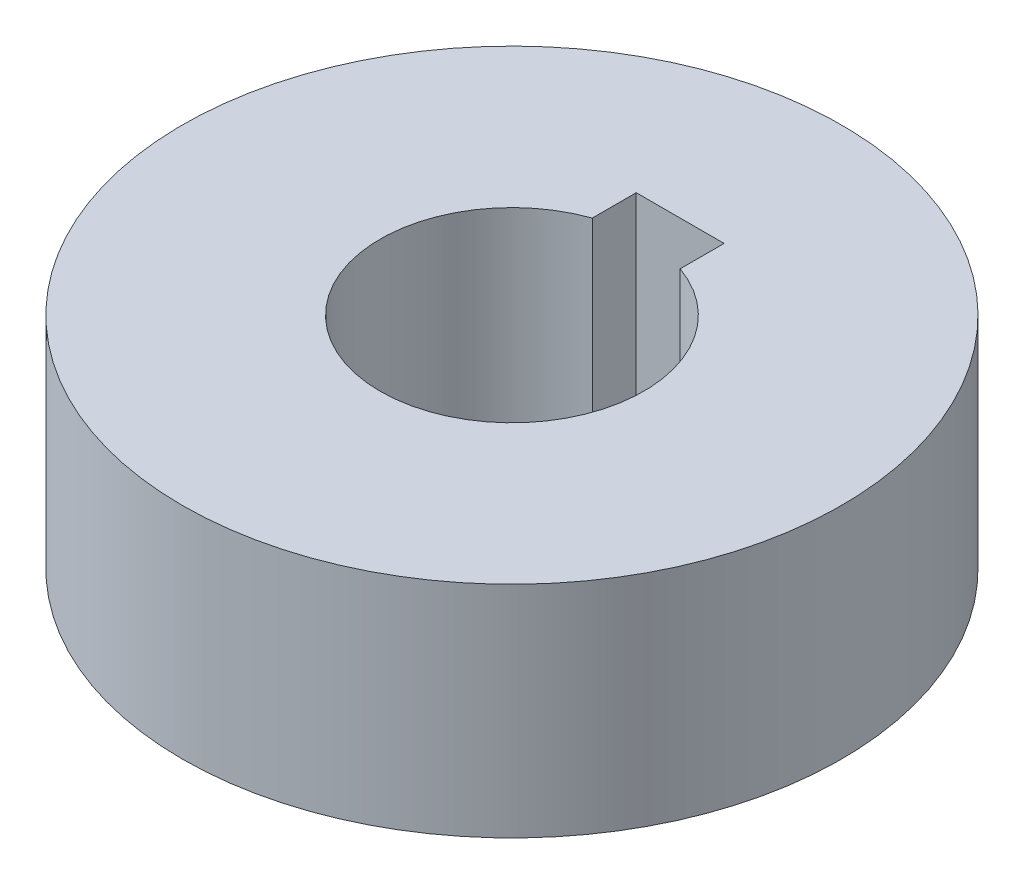
ISO-10303-21;
HEADER;
FILE_DESCRIPTION(('STEP AP214'),'2;1');
FILE_NAME('part.step','',(''),(''),'','','');
FILE_SCHEMA(('AUTOMOTIVE_DESIGN { 1 0 10303 214 1 1 1 1 }'));
ENDSEC;
DATA;
#1=APPLICATION_CONTEXT('core data for automotive mechanical design processes');
#2=APPLICATION_PROTOCOL_DEFINITION('international standard','automotive_design',2000,#1);
#3=PRODUCT_CONTEXT('',#1,'mechanical');
#4=PRODUCT('Part','Part','',(#3));
#5=PRODUCT_RELATED_PRODUCT_CATEGORY('part','',(#4));
#6=PRODUCT_DEFINITION_FORMATION('','',#4);
#7=PRODUCT_DEFINITION_CONTEXT('part definition',#1,'design');
#8=PRODUCT_DEFINITION('design','',#6,#7);
#9=PRODUCT_DEFINITION_SHAPE('','',#8);
#10=(LENGTH_UNIT() NAMED_UNIT(*) SI_UNIT(.MILLI.,.METRE.));
#11=(NAMED_UNIT(*) PLANE_ANGLE_UNIT() SI_UNIT($,.RADIAN.));
#12=(NAMED_UNIT(*) SI_UNIT($,.STERADIAN.) SOLID_ANGLE_UNIT());
#13=UNCERTAINTY_MEASURE_WITH_UNIT(LENGTH_MEASURE(1.E-05),#10,'distance_accuracy_value','');
#14=(GEOMETRIC_REPRESENTATION_CONTEXT(3) GLOBAL_UNCERTAINTY_ASSIGNED_CONTEXT((#13)) GLOBAL_UNIT_ASSIGNED_CONTEXT((#10,
#11,#12)) REPRESENTATION_CONTEXT('',''));
#15=CARTESIAN_POINT('',(0.,0.,0.));
#16=DIRECTION('',(0.,0.,1.));
#17=DIRECTION('',(1.,0.,0.));
#18=AXIS2_PLACEMENT_3D('',#15,#16,#17);
#19=CARTESIAN_POINT('',(0.,10.,0.));
#20=DIRECTION('',(0.,1.,0.));
#21=DIRECTION('',(0.,0.,1.));
#22=AXIS2_PLACEMENT_3D('',#19,#20,#21);
#23=PLANE('',#22);
#24=CARTESIAN_POINT('',(0.,10.,0.));
#25=DIRECTION('',(0.,1.,0.));
#26=DIRECTION('',(0.,0.,1.));
#27=AXIS2_PLACEMENT_3D('',#24,#25,#26);
#28=CIRCLE('',#27,15.);
#29=CARTESIAN_POINT('',(0.,10.,15.));
#30=VERTEX_POINT('',#29);
#31=EDGE_CURVE('E11',#30,#30,#28,.T.);
#32=ORIENTED_EDGE('',*,*,#31,.T.);
#33=EDGE_LOOP('',(#32));
#34=FACE_BOUND('',#33,.T.);
#35=DIRECTION('',(-1.,0.,0.));
#36=VECTOR('',#35,1.);
#37=CARTESIAN_POINT('',(0.,10.,-7.65685424949238));
#38=LINE('',#37,#36);
#39=CARTESIAN_POINT('',(2.,10.,-7.65685424949238));
#40=VERTEX_POINT('',#39);
#41=CARTESIAN_POINT('',(-2.,10.,-7.65685424949238));
#42=VERTEX_POINT('',#41);
#43=EDGE_CURVE('E93',#40,#42,#38,.T.);
#44=ORIENTED_EDGE('',*,*,#43,.F.);
#45=DIRECTION('',(0.,0.,1.));
#46=VECTOR('',#45,1.);
#47=CARTESIAN_POINT('',(2.,10.,0.));
#48=LINE('',#47,#46);
#49=CARTESIAN_POINT('',(2.,10.,-5.65685424949238));
#50=VERTEX_POINT('',#49);
#51=EDGE_CURVE('E107',#40,#50,#48,.T.);
#52=ORIENTED_EDGE('',*,*,#51,.T.);
#53=CARTESIAN_POINT('',(0.,10.,0.));
#54=DIRECTION('',(0.,1.,0.));
#55=DIRECTION('',(0.,0.,1.));
#56=AXIS2_PLACEMENT_3D('',#53,#54,#55);
#57=CIRCLE('',#56,6.);
#58=CARTESIAN_POINT('',(-2.,10.,-5.65685424949238));
#59=VERTEX_POINT('',#58);
#60=EDGE_CURVE('E115',#59,#50,#57,.T.);
#61=ORIENTED_EDGE('',*,*,#60,.F.);
#62=DIRECTION('',(0.,0.,1.));
#63=VECTOR('',#62,1.);
#64=CARTESIAN_POINT('',(-2.,10.,0.));
#65=LINE('',#64,#63);
#66=EDGE_CURVE('E57',#42,#59,#65,.T.);
#67=ORIENTED_EDGE('',*,*,#66,.F.);
#68=EDGE_LOOP('',(#44,#52,#61,#67));
#69=FACE_BOUND('',#68,.T.);
#70=ADVANCED_FACE('F42',(#34,#69),#23,.T.);
#71=CARTESIAN_POINT('',(0.,0.,0.));
#72=DIRECTION('',(0.,1.,0.));
#73=DIRECTION('',(0.,0.,1.));
#74=AXIS2_PLACEMENT_3D('',#71,#72,#73);
#75=PLANE('',#74);
#76=CARTESIAN_POINT('',(0.,0.,0.));
#77=DIRECTION('',(0.,1.,0.));
#78=DIRECTION('',(0.,0.,1.));
#79=AXIS2_PLACEMENT_3D('',#76,#77,#78);
#80=CIRCLE('',#79,15.);
#81=CARTESIAN_POINT('',(0.,0.,15.));
#82=VERTEX_POINT('',#81);
#83=EDGE_CURVE('E46',#82,#82,#80,.T.);
#84=ORIENTED_EDGE('',*,*,#83,.F.);
#85=EDGE_LOOP('',(#84));
#86=FACE_BOUND('',#85,.T.);
#87=DIRECTION('',(0.,0.,1.));
#88=VECTOR('',#87,1.);
#89=CARTESIAN_POINT('',(2.,0.,0.));
#90=LINE('',#89,#88);
#91=CARTESIAN_POINT('',(2.,0.,-7.65685424949238));
#92=VERTEX_POINT('',#91);
#93=CARTESIAN_POINT('',(2.,0.,-5.65685424949238));
#94=VERTEX_POINT('',#93);
#95=EDGE_CURVE('E66',#92,#94,#90,.T.);
#96=ORIENTED_EDGE('',*,*,#95,.F.);
#97=DIRECTION('',(-1.,0.,0.));
#98=VECTOR('',#97,1.);
#99=CARTESIAN_POINT('',(0.,0.,-7.65685424949238));
#100=LINE('',#99,#98);
#101=CARTESIAN_POINT('',(-2.,0.,-7.65685424949238));
#102=VERTEX_POINT('',#101);
#103=EDGE_CURVE('E91',#92,#102,#100,.T.);
#104=ORIENTED_EDGE('',*,*,#103,.T.);
#105=DIRECTION('',(0.,0.,1.));
#106=VECTOR('',#105,1.);
#107=CARTESIAN_POINT('',(-2.,0.,0.));
#108=LINE('',#107,#106);
#109=CARTESIAN_POINT('',(-2.,0.,-5.65685424949238));
#110=VERTEX_POINT('',#109);
#111=EDGE_CURVE('E97',#102,#110,#108,.T.);
#112=ORIENTED_EDGE('',*,*,#111,.T.);
#113=CARTESIAN_POINT('',(0.,0.,0.));
#114=DIRECTION('',(0.,1.,0.));
#115=DIRECTION('',(0.,0.,1.));
#116=AXIS2_PLACEMENT_3D('',#113,#114,#115);
#117=CIRCLE('',#116,6.);
#118=EDGE_CURVE('E112',#110,#94,#117,.T.);
#119=ORIENTED_EDGE('',*,*,#118,.T.);
#120=EDGE_LOOP('',(#96,#104,#112,#119));
#121=FACE_BOUND('',#120,.T.);
#122=ADVANCED_FACE('F103',(#86,#121),#75,.F.);
#123=CARTESIAN_POINT('',(0.,10.,0.));
#124=DIRECTION('',(0.,-1.,0.));
#125=DIRECTION('',(0.,0.,-1.));
#126=AXIS2_PLACEMENT_3D('',#123,#124,#125);
#127=CYLINDRICAL_SURFACE('',#126,6.);
#128=ORIENTED_EDGE('',*,*,#60,.T.);
#129=DIRECTION('',(0.,1.,0.));
#130=VECTOR('',#129,1.);
#131=CARTESIAN_POINT('',(2.,0.,-5.65685424949238));
#132=LINE('',#131,#130);
#133=EDGE_CURVE('E79',#94,#50,#132,.T.);
#134=ORIENTED_EDGE('',*,*,#133,.F.);
#135=ORIENTED_EDGE('',*,*,#118,.F.);
#136=DIRECTION('',(0.,1.,0.));
#137=VECTOR('',#136,1.);
#138=CARTESIAN_POINT('',(-2.,0.,-5.65685424949238));
#139=LINE('',#138,#137);
#140=EDGE_CURVE('E94',#110,#59,#139,.T.);
#141=ORIENTED_EDGE('',*,*,#140,.T.);
#142=EDGE_LOOP('',(#128,#134,#135,#141));
#143=FACE_BOUND('',#142,.T.);
#144=ADVANCED_FACE('F119',(#143),#127,.F.);
#145=CARTESIAN_POINT('',(0.,10.,0.));
#146=DIRECTION('',(0.,-1.,0.));
#147=DIRECTION('',(0.,0.,-1.));
#148=AXIS2_PLACEMENT_3D('',#145,#146,#147);
#149=CYLINDRICAL_SURFACE('',#148,15.);
#150=ORIENTED_EDGE('',*,*,#31,.F.);
#151=EDGE_LOOP('',(#150));
#152=FACE_BOUND('',#151,.T.);
#153=ORIENTED_EDGE('',*,*,#83,.T.);
#154=EDGE_LOOP('',(#153));
#155=FACE_BOUND('',#154,.T.);
#156=ADVANCED_FACE('F44',(#152,#155),#149,.T.);
#157=CARTESIAN_POINT('',(2.,0.,0.));
#158=DIRECTION('',(-1.,0.,0.));
#159=DIRECTION('',(0.,0.,1.));
#160=AXIS2_PLACEMENT_3D('',#157,#158,#159);
#161=PLANE('',#160);
#162=ORIENTED_EDGE('',*,*,#51,.F.);
#163=DIRECTION('',(0.,1.,0.));
#164=VECTOR('',#163,1.);
#165=CARTESIAN_POINT('',(2.,0.,-7.65685424949238));
#166=LINE('',#165,#164);
#167=EDGE_CURVE('E82',#92,#40,#166,.T.);
#168=ORIENTED_EDGE('',*,*,#167,.F.);
#169=ORIENTED_EDGE('',*,*,#95,.T.);
#170=ORIENTED_EDGE('',*,*,#133,.T.);
#171=EDGE_LOOP('',(#162,#168,#169,#170));
#172=FACE_BOUND('',#171,.T.);
#173=ADVANCED_FACE('F122',(#172),#161,.T.);
#174=CARTESIAN_POINT('',(-2.,0.,0.));
#175=DIRECTION('',(-1.,0.,0.));
#176=DIRECTION('',(0.,0.,1.));
#177=AXIS2_PLACEMENT_3D('',#174,#175,#176);
#178=PLANE('',#177);
#179=ORIENTED_EDGE('',*,*,#66,.T.);
#180=ORIENTED_EDGE('',*,*,#140,.F.);
#181=ORIENTED_EDGE('',*,*,#111,.F.);
#182=DIRECTION('',(0.,1.,0.));
#183=VECTOR('',#182,1.);
#184=CARTESIAN_POINT('',(-2.,0.,-7.65685424949238));
#185=LINE('',#184,#183);
#186=EDGE_CURVE('E87',#102,#42,#185,.T.);
#187=ORIENTED_EDGE('',*,*,#186,.T.);
#188=EDGE_LOOP('',(#179,#180,#181,#187));
#189=FACE_BOUND('',#188,.T.);
#190=ADVANCED_FACE('F98',(#189),#178,.F.);
#191=CARTESIAN_POINT('',(0.,0.,-7.65685424949238));
#192=DIRECTION('',(0.,0.,-1.));
#193=DIRECTION('',(-1.,0.,0.));
#194=AXIS2_PLACEMENT_3D('',#191,#192,#193);
#195=PLANE('',#194);
#196=ORIENTED_EDGE('',*,*,#43,.T.);
#197=ORIENTED_EDGE('',*,*,#186,.F.);
#198=ORIENTED_EDGE('',*,*,#103,.F.);
#199=ORIENTED_EDGE('',*,*,#167,.T.);
#200=EDGE_LOOP('',(#196,#197,#198,#199));
#201=FACE_BOUND('',#200,.T.);
#202=ADVANCED_FACE('F89',(#201),#195,.F.);
#203=CLOSED_SHELL('',(#70,#122,#144,#156,#173,#190,#202));
#204=MANIFOLD_SOLID_BREP('B2',#203);
#205=ADVANCED_BREP_SHAPE_REPRESENTATION('',(#18,#204),#14);
#206=SHAPE_DEFINITION_REPRESENTATION(#9,#205);
ENDSEC;
END-ISO-10303-21;
